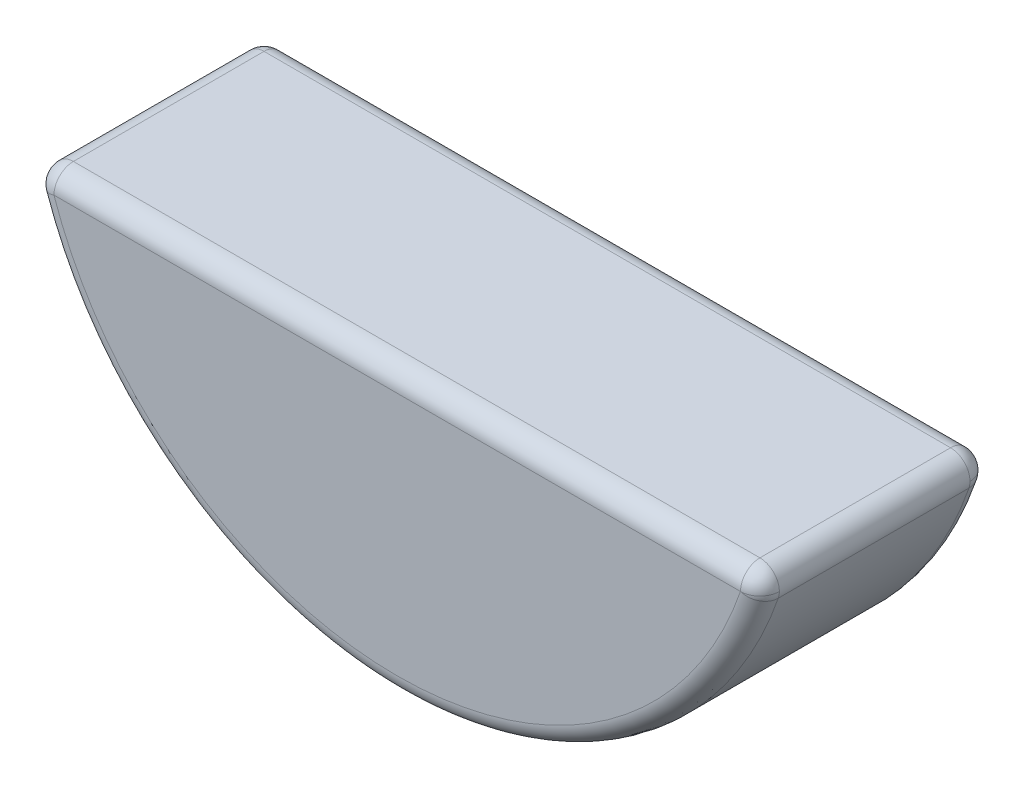
ISO-10303-21;
HEADER;
FILE_DESCRIPTION(('STEP AP214'),'2;1');
FILE_NAME('part.step','',(''),(''),'','','');
FILE_SCHEMA(('AUTOMOTIVE_DESIGN { 1 0 10303 214 1 1 1 1 }'));
ENDSEC;
DATA;
#1=APPLICATION_CONTEXT('core data for automotive mechanical design processes');
#2=APPLICATION_PROTOCOL_DEFINITION('international standard','automotive_design',2000,#1);
#3=PRODUCT_CONTEXT('',#1,'mechanical');
#4=PRODUCT('Part','Part','',(#3));
#5=PRODUCT_RELATED_PRODUCT_CATEGORY('part','',(#4));
#6=PRODUCT_DEFINITION_FORMATION('','',#4);
#7=PRODUCT_DEFINITION_CONTEXT('part definition',#1,'design');
#8=PRODUCT_DEFINITION('design','',#6,#7);
#9=PRODUCT_DEFINITION_SHAPE('','',#8);
#10=(LENGTH_UNIT() NAMED_UNIT(*) SI_UNIT(.MILLI.,.METRE.));
#11=(NAMED_UNIT(*) PLANE_ANGLE_UNIT() SI_UNIT($,.RADIAN.));
#12=(NAMED_UNIT(*) SI_UNIT($,.STERADIAN.) SOLID_ANGLE_UNIT());
#13=UNCERTAINTY_MEASURE_WITH_UNIT(LENGTH_MEASURE(1.E-05),#10,'distance_accuracy_value','');
#14=(GEOMETRIC_REPRESENTATION_CONTEXT(3) GLOBAL_UNCERTAINTY_ASSIGNED_CONTEXT((#13)) GLOBAL_UNIT_ASSIGNED_CONTEXT((#10,
#11,#12)) REPRESENTATION_CONTEXT('',''));
#15=CARTESIAN_POINT('',(0.,0.,0.));
#16=DIRECTION('',(0.,0.,1.));
#17=DIRECTION('',(1.,0.,0.));
#18=AXIS2_PLACEMENT_3D('',#15,#16,#17);
#19=CARTESIAN_POINT('',(4.48689237132197,-1.54671033104868,-1.246));
#20=DIRECTION('',(0.,1.,0.));
#21=DIRECTION('',(1.,0.,0.));
#22=AXIS2_PLACEMENT_3D('',#19,#20,#21);
#23=SPHERICAL_SURFACE('',#22,0.254);
#24=CARTESIAN_POINT('',(4.48689237132197,-1.54671033104868,-1.246));
#25=DIRECTION('',(0.325897667730442,0.945405050847444,0.));
#26=DIRECTION('',(-0.945405050847444,0.325897667730442,0.));
#27=AXIS2_PLACEMENT_3D('',#24,#25,#26);
#28=CIRCLE('',#27,0.254);
#29=CARTESIAN_POINT('',(4.72702525423722,-1.62948833865222,-1.246));
#30=VERTEX_POINT('',#29);
#31=CARTESIAN_POINT('',(4.48689237132197,-1.54671033104867,-1.5));
#32=VERTEX_POINT('',#31);
#33=EDGE_CURVE('E11',#30,#32,#28,.T.);
#34=ORIENTED_EDGE('',*,*,#33,.T.);
#35=CARTESIAN_POINT('',(4.48689237132197,-1.54671033104868,-1.246));
#36=DIRECTION('',(0.,-1.,0.));
#37=DIRECTION('',(0.,0.,-1.));
#38=AXIS2_PLACEMENT_3D('',#35,#36,#37);
#39=CIRCLE('',#38,0.254);
#40=CARTESIAN_POINT('',(4.74089237132197,-1.54671033104868,-1.246));
#41=VERTEX_POINT('',#40);
#42=EDGE_CURVE('E27',#32,#41,#39,.T.);
#43=ORIENTED_EDGE('',*,*,#42,.T.);
#44=CARTESIAN_POINT('',(4.48689237132197,-1.54671033104868,-1.246));
#45=DIRECTION('',(0.,0.,1.));
#46=DIRECTION('',(-1.,0.,0.));
#47=AXIS2_PLACEMENT_3D('',#44,#45,#46);
#48=CIRCLE('',#47,0.254);
#49=EDGE_CURVE('E173',#30,#41,#48,.T.);
#50=ORIENTED_EDGE('',*,*,#49,.F.);
#51=EDGE_LOOP('',(#34,#43,#50));
#52=FACE_BOUND('',#51,.T.);
#53=ADVANCED_FACE('F16',(#52),#23,.T.);
#54=CARTESIAN_POINT('',(4.48689237132197,-1.54671033104868,1.246));
#55=DIRECTION('',(0.,1.,0.));
#56=DIRECTION('',(1.,0.,0.));
#57=AXIS2_PLACEMENT_3D('',#54,#55,#56);
#58=SPHERICAL_SURFACE('',#57,0.254);
#59=CARTESIAN_POINT('',(4.48689237132197,-1.54671033104868,1.246));
#60=DIRECTION('',(0.,0.,-1.));
#61=DIRECTION('',(1.,0.,0.));
#62=AXIS2_PLACEMENT_3D('',#59,#60,#61);
#63=CIRCLE('',#62,0.254);
#64=CARTESIAN_POINT('',(4.74089237132197,-1.54671033104868,1.246));
#65=VERTEX_POINT('',#64);
#66=CARTESIAN_POINT('',(4.72702525423722,-1.62948833865222,1.246));
#67=VERTEX_POINT('',#66);
#68=EDGE_CURVE('E147',#65,#67,#63,.T.);
#69=ORIENTED_EDGE('',*,*,#68,.F.);
#70=CARTESIAN_POINT('',(4.48689237132197,-1.54671033104868,1.246));
#71=DIRECTION('',(0.,-1.,0.));
#72=DIRECTION('',(0.,0.,-1.));
#73=AXIS2_PLACEMENT_3D('',#70,#71,#72);
#74=CIRCLE('',#73,0.254);
#75=CARTESIAN_POINT('',(4.48689237132197,-1.54671033104867,1.5));
#76=VERTEX_POINT('',#75);
#77=EDGE_CURVE('E142',#65,#76,#74,.T.);
#78=ORIENTED_EDGE('',*,*,#77,.T.);
#79=CARTESIAN_POINT('',(4.48689237132197,-1.54671033104867,1.246));
#80=DIRECTION('',(0.325897667730488,0.945405050847428,0.));
#81=DIRECTION('',(-0.945405050847428,0.325897667730488,0.));
#82=AXIS2_PLACEMENT_3D('',#79,#80,#81);
#83=CIRCLE('',#82,0.254);
#84=EDGE_CURVE('E135',#76,#67,#83,.T.);
#85=ORIENTED_EDGE('',*,*,#84,.T.);
#86=EDGE_LOOP('',(#69,#78,#85));
#87=FACE_BOUND('',#86,.T.);
#88=ADVANCED_FACE('F146',(#87),#58,.T.);
#89=CARTESIAN_POINT('',(-4.48689237132197,-1.54671033104868,1.5));
#90=DIRECTION('',(0.,0.,-1.));
#91=DIRECTION('',(-1.,0.,0.));
#92=AXIS2_PLACEMENT_3D('',#89,#90,#91);
#93=CYLINDRICAL_SURFACE('',#92,0.254);
#94=CARTESIAN_POINT('',(-4.48689237132197,-1.54671033104868,1.246));
#95=DIRECTION('',(0.,0.,1.));
#96=DIRECTION('',(1.,0.,0.));
#97=AXIS2_PLACEMENT_3D('',#94,#95,#96);
#98=CIRCLE('',#97,0.254);
#99=CARTESIAN_POINT('',(-4.74089237132197,-1.54671033104868,1.246));
#100=VERTEX_POINT('',#99);
#101=CARTESIAN_POINT('',(-4.72702525423722,-1.62948833865222,1.246));
#102=VERTEX_POINT('',#101);
#103=EDGE_CURVE('E179',#100,#102,#98,.T.);
#104=ORIENTED_EDGE('',*,*,#103,.F.);
#105=DIRECTION('',(0.,0.,-1.));
#106=VECTOR('',#105,1.);
#107=CARTESIAN_POINT('',(-4.74089237132197,-1.54671033104868,1.5));
#108=LINE('',#107,#106);
#109=CARTESIAN_POINT('',(-4.74089237132197,-1.54671033104868,-1.246));
#110=VERTEX_POINT('',#109);
#111=EDGE_CURVE('E143',#100,#110,#108,.T.);
#112=ORIENTED_EDGE('',*,*,#111,.T.);
#113=CARTESIAN_POINT('',(-4.48689237132197,-1.54671033104868,-1.246));
#114=DIRECTION('',(0.,0.,-1.));
#115=DIRECTION('',(-1.,0.,0.));
#116=AXIS2_PLACEMENT_3D('',#113,#114,#115);
#117=CIRCLE('',#116,0.254);
#118=CARTESIAN_POINT('',(-4.72702525423722,-1.62948833865222,-1.246));
#119=VERTEX_POINT('',#118);
#120=EDGE_CURVE('E183',#119,#110,#117,.T.);
#121=ORIENTED_EDGE('',*,*,#120,.F.);
#122=DIRECTION('',(0.,0.,-1.));
#123=VECTOR('',#122,1.);
#124=CARTESIAN_POINT('',(-4.72702525423722,-1.62948833865222,1.5));
#125=LINE('',#124,#123);
#126=EDGE_CURVE('E201',#102,#119,#125,.T.);
#127=ORIENTED_EDGE('',*,*,#126,.F.);
#128=EDGE_LOOP('',(#104,#112,#121,#127));
#129=FACE_BOUND('',#128,.T.);
#130=ADVANCED_FACE('F310',(#129),#93,.T.);
#131=CARTESIAN_POINT('',(0.,0.,1.5));
#132=DIRECTION('',(0.,0.,-1.));
#133=DIRECTION('',(-1.,0.,0.));
#134=AXIS2_PLACEMENT_3D('',#131,#132,#133);
#135=CYLINDRICAL_SURFACE('',#134,5.);
#136=ORIENTED_EDGE('',*,*,#126,.T.);
#137=CARTESIAN_POINT('',(0.,0.,-1.246));
#138=DIRECTION('',(0.,0.,1.));
#139=DIRECTION('',(1.,0.,0.));
#140=AXIS2_PLACEMENT_3D('',#137,#138,#139);
#141=CIRCLE('',#140,5.);
#142=EDGE_CURVE('E205',#119,#30,#141,.T.);
#143=ORIENTED_EDGE('',*,*,#142,.T.);
#144=DIRECTION('',(0.,0.,1.));
#145=VECTOR('',#144,1.);
#146=CARTESIAN_POINT('',(4.72702525423722,-1.62948833865222,1.5));
#147=LINE('',#146,#145);
#148=EDGE_CURVE('E209',#30,#67,#147,.T.);
#149=ORIENTED_EDGE('',*,*,#148,.T.);
#150=CARTESIAN_POINT('',(0.,0.,1.246));
#151=DIRECTION('',(0.,0.,-1.));
#152=DIRECTION('',(1.,0.,0.));
#153=AXIS2_PLACEMENT_3D('',#150,#151,#152);
#154=CIRCLE('',#153,5.);
#155=EDGE_CURVE('E139',#67,#102,#154,.T.);
#156=ORIENTED_EDGE('',*,*,#155,.T.);
#157=EDGE_LOOP('',(#136,#143,#149,#156));
#158=FACE_BOUND('',#157,.T.);
#159=ADVANCED_FACE('F325',(#158),#135,.T.);
#160=CARTESIAN_POINT('',(-4.83,-1.29271033104868,1.5));
#161=DIRECTION('',(0.,-1.,0.));
#162=DIRECTION('',(0.,0.,-1.));
#163=AXIS2_PLACEMENT_3D('',#160,#161,#162);
#164=PLANE('',#163);
#165=DIRECTION('',(1.,0.,0.));
#166=VECTOR('',#165,1.);
#167=CARTESIAN_POINT('',(4.83,-1.29271033104868,1.246));
#168=LINE('',#167,#166);
#169=CARTESIAN_POINT('',(-4.48689237132197,-1.29271033104868,1.246));
#170=VERTEX_POINT('',#169);
#171=CARTESIAN_POINT('',(4.48689237132197,-1.29271033104868,1.246));
#172=VERTEX_POINT('',#171);
#173=EDGE_CURVE('E190',#170,#172,#168,.T.);
#174=ORIENTED_EDGE('',*,*,#173,.T.);
#175=DIRECTION('',(0.,0.,-1.));
#176=VECTOR('',#175,1.);
#177=CARTESIAN_POINT('',(4.48689237132197,-1.29271033104868,1.5));
#178=LINE('',#177,#176);
#179=CARTESIAN_POINT('',(4.48689237132197,-1.29271033104868,-1.246));
#180=VERTEX_POINT('',#179);
#181=EDGE_CURVE('E186',#172,#180,#178,.T.);
#182=ORIENTED_EDGE('',*,*,#181,.T.);
#183=DIRECTION('',(-1.,0.,0.));
#184=VECTOR('',#183,1.);
#185=CARTESIAN_POINT('',(-4.83,-1.29271033104868,-1.246));
#186=LINE('',#185,#184);
#187=CARTESIAN_POINT('',(-4.48689237132197,-1.29271033104868,-1.246));
#188=VERTEX_POINT('',#187);
#189=EDGE_CURVE('E191',#180,#188,#186,.T.);
#190=ORIENTED_EDGE('',*,*,#189,.T.);
#191=DIRECTION('',(0.,0.,1.));
#192=VECTOR('',#191,1.);
#193=CARTESIAN_POINT('',(-4.48689237132197,-1.29271033104868,1.5));
#194=LINE('',#193,#192);
#195=EDGE_CURVE('E131',#188,#170,#194,.T.);
#196=ORIENTED_EDGE('',*,*,#195,.T.);
#197=EDGE_LOOP('',(#174,#182,#190,#196));
#198=FACE_BOUND('',#197,.T.);
#199=ADVANCED_FACE('F221',(#198),#164,.F.);
#200=CARTESIAN_POINT('',(0.,0.,1.5));
#201=DIRECTION('',(0.,0.,1.));
#202=DIRECTION('',(1.,0.,0.));
#203=AXIS2_PLACEMENT_3D('',#200,#201,#202);
#204=PLANE('',#203);
#205=CARTESIAN_POINT('',(0.,0.,1.5));
#206=DIRECTION('',(0.,0.,1.));
#207=DIRECTION('',(1.,0.,0.));
#208=AXIS2_PLACEMENT_3D('',#205,#206,#207);
#209=CIRCLE('',#208,4.746);
#210=CARTESIAN_POINT('',(-4.48689237132197,-1.54671033104867,1.5));
#211=VERTEX_POINT('',#210);
#212=EDGE_CURVE('E123',#211,#76,#209,.T.);
#213=ORIENTED_EDGE('',*,*,#212,.T.);
#214=DIRECTION('',(-1.,0.,0.));
#215=VECTOR('',#214,1.);
#216=CARTESIAN_POINT('',(-4.83,-1.54671033104868,1.5));
#217=LINE('',#216,#215);
#218=EDGE_CURVE('E114',#76,#211,#217,.T.);
#219=ORIENTED_EDGE('',*,*,#218,.T.);
#220=EDGE_LOOP('',(#213,#219));
#221=FACE_BOUND('',#220,.T.);
#222=ADVANCED_FACE('F126',(#221),#204,.T.);
#223=CARTESIAN_POINT('',(0.,0.,-1.5));
#224=DIRECTION('',(0.,0.,1.));
#225=DIRECTION('',(1.,0.,0.));
#226=AXIS2_PLACEMENT_3D('',#223,#224,#225);
#227=PLANE('',#226);
#228=CARTESIAN_POINT('',(0.,0.,-1.5));
#229=DIRECTION('',(0.,0.,-1.));
#230=DIRECTION('',(1.,0.,0.));
#231=AXIS2_PLACEMENT_3D('',#228,#229,#230);
#232=CIRCLE('',#231,4.746);
#233=CARTESIAN_POINT('',(-4.48689237132197,-1.54671033104867,-1.5));
#234=VERTEX_POINT('',#233);
#235=EDGE_CURVE('E20',#32,#234,#232,.T.);
#236=ORIENTED_EDGE('',*,*,#235,.T.);
#237=DIRECTION('',(1.,0.,0.));
#238=VECTOR('',#237,1.);
#239=CARTESIAN_POINT('',(0.,-1.54671033104868,-1.5));
#240=LINE('',#239,#238);
#241=EDGE_CURVE('E41',#234,#32,#240,.T.);
#242=ORIENTED_EDGE('',*,*,#241,.T.);
#243=EDGE_LOOP('',(#236,#242));
#244=FACE_BOUND('',#243,.T.);
#245=ADVANCED_FACE('F397',(#244),#227,.F.);
#246=CARTESIAN_POINT('',(-4.48689237132197,-1.54671033104868,1.5));
#247=DIRECTION('',(0.,0.,-1.));
#248=DIRECTION('',(-1.,0.,0.));
#249=AXIS2_PLACEMENT_3D('',#246,#247,#248);
#250=CYLINDRICAL_SURFACE('',#249,0.254);
#251=ORIENTED_EDGE('',*,*,#111,.F.);
#252=CARTESIAN_POINT('',(-4.48689237132197,-1.54671033104868,1.246));
#253=DIRECTION('',(0.,0.,1.));
#254=DIRECTION('',(1.,0.,0.));
#255=AXIS2_PLACEMENT_3D('',#252,#253,#254);
#256=CIRCLE('',#255,0.254);
#257=EDGE_CURVE('E90',#170,#100,#256,.T.);
#258=ORIENTED_EDGE('',*,*,#257,.F.);
#259=ORIENTED_EDGE('',*,*,#195,.F.);
#260=CARTESIAN_POINT('',(-4.48689237132197,-1.54671033104868,-1.246));
#261=DIRECTION('',(0.,0.,-1.));
#262=DIRECTION('',(-1.,0.,0.));
#263=AXIS2_PLACEMENT_3D('',#260,#261,#262);
#264=CIRCLE('',#263,0.254);
#265=EDGE_CURVE('E195',#110,#188,#264,.T.);
#266=ORIENTED_EDGE('',*,*,#265,.F.);
#267=EDGE_LOOP('',(#251,#258,#259,#266));
#268=FACE_BOUND('',#267,.T.);
#269=ADVANCED_FACE('F359',(#268),#250,.T.);
#270=CARTESIAN_POINT('',(-4.48689237132197,-1.54671033104868,1.246));
#271=DIRECTION('',(0.,1.,0.));
#272=DIRECTION('',(1.,0.,0.));
#273=AXIS2_PLACEMENT_3D('',#270,#271,#272);
#274=SPHERICAL_SURFACE('',#273,0.254);
#275=CARTESIAN_POINT('',(-4.48689237132201,-1.54671033104868,1.246));
#276=DIRECTION('',(1.,-1.43422019667374E-13,0.));
#277=DIRECTION('',(-1.43422019667374E-13,-1.,0.));
#278=AXIS2_PLACEMENT_3D('',#275,#276,#277);
#279=CIRCLE('',#278,0.254);
#280=EDGE_CURVE('E103',#170,#211,#279,.T.);
#281=ORIENTED_EDGE('',*,*,#280,.F.);
#282=ORIENTED_EDGE('',*,*,#257,.T.);
#283=ORIENTED_EDGE('',*,*,#103,.T.);
#284=CARTESIAN_POINT('',(-4.48689237132197,-1.54671033104868,1.246));
#285=DIRECTION('',(0.325897667730442,-0.945405050847444,0.));
#286=DIRECTION('',(-0.945405050847444,-0.325897667730442,0.));
#287=AXIS2_PLACEMENT_3D('',#284,#285,#286);
#288=CIRCLE('',#287,0.254);
#289=EDGE_CURVE('E192',#211,#102,#288,.T.);
#290=ORIENTED_EDGE('',*,*,#289,.F.);
#291=EDGE_LOOP('',(#281,#282,#283,#290));
#292=FACE_BOUND('',#291,.T.);
#293=ADVANCED_FACE('F223',(#292),#274,.T.);
#294=CARTESIAN_POINT('',(-4.48689237132197,-1.54671033104868,-1.246));
#295=DIRECTION('',(0.,1.,0.));
#296=DIRECTION('',(1.,0.,0.));
#297=AXIS2_PLACEMENT_3D('',#294,#295,#296);
#298=SPHERICAL_SURFACE('',#297,0.254);
#299=CARTESIAN_POINT('',(-4.48689237132197,-1.54671033104867,-1.246));
#300=DIRECTION('',(0.325897667730488,-0.945405050847428,0.));
#301=DIRECTION('',(-0.945405050847428,-0.325897667730488,0.));
#302=AXIS2_PLACEMENT_3D('',#299,#300,#301);
#303=CIRCLE('',#302,0.254);
#304=EDGE_CURVE('E156',#119,#234,#303,.T.);
#305=ORIENTED_EDGE('',*,*,#304,.F.);
#306=ORIENTED_EDGE('',*,*,#120,.T.);
#307=ORIENTED_EDGE('',*,*,#265,.T.);
#308=CARTESIAN_POINT('',(-4.48689237132197,-1.54671033104868,-1.246));
#309=DIRECTION('',(1.,0.,-1.43422019667374E-13));
#310=DIRECTION('',(1.43422019667374E-13,0.,1.));
#311=AXIS2_PLACEMENT_3D('',#308,#309,#310);
#312=CIRCLE('',#311,0.254);
#313=EDGE_CURVE('E164',#234,#188,#312,.T.);
#314=ORIENTED_EDGE('',*,*,#313,.F.);
#315=EDGE_LOOP('',(#305,#306,#307,#314));
#316=FACE_BOUND('',#315,.T.);
#317=ADVANCED_FACE('F317',(#316),#298,.T.);
#318=CARTESIAN_POINT('',(0.,0.,1.246));
#319=DIRECTION('',(0.,0.,1.));
#320=DIRECTION('',(1.,0.,0.));
#321=AXIS2_PLACEMENT_3D('',#318,#319,#320);
#322=TOROIDAL_SURFACE('',#321,4.746,0.254);
#323=ORIENTED_EDGE('',*,*,#289,.T.);
#324=ORIENTED_EDGE('',*,*,#155,.F.);
#325=ORIENTED_EDGE('',*,*,#84,.F.);
#326=ORIENTED_EDGE('',*,*,#212,.F.);
#327=EDGE_LOOP('',(#323,#324,#325,#326));
#328=FACE_BOUND('',#327,.T.);
#329=ADVANCED_FACE('F137',(#328),#322,.T.);
#330=CARTESIAN_POINT('',(0.,-1.54671033104868,1.246));
#331=DIRECTION('',(1.,0.,0.));
#332=DIRECTION('',(0.,0.,-1.));
#333=AXIS2_PLACEMENT_3D('',#330,#331,#332);
#334=CYLINDRICAL_SURFACE('',#333,0.254);
#335=ORIENTED_EDGE('',*,*,#280,.T.);
#336=ORIENTED_EDGE('',*,*,#218,.F.);
#337=CARTESIAN_POINT('',(4.48689237132197,-1.54671033104868,1.246));
#338=DIRECTION('',(1.,0.,-1.43422019667374E-13));
#339=DIRECTION('',(-1.43422019667374E-13,0.,-1.));
#340=AXIS2_PLACEMENT_3D('',#337,#338,#339);
#341=CIRCLE('',#340,0.254);
#342=EDGE_CURVE('E118',#172,#76,#341,.T.);
#343=ORIENTED_EDGE('',*,*,#342,.F.);
#344=ORIENTED_EDGE('',*,*,#173,.F.);
#345=EDGE_LOOP('',(#335,#336,#343,#344));
#346=FACE_BOUND('',#345,.T.);
#347=ADVANCED_FACE('F116',(#346),#334,.T.);
#348=CARTESIAN_POINT('',(-4.83,-1.54671033104868,-1.246));
#349=DIRECTION('',(-1.,0.,0.));
#350=DIRECTION('',(0.,0.,1.));
#351=AXIS2_PLACEMENT_3D('',#348,#349,#350);
#352=CYLINDRICAL_SURFACE('',#351,0.254);
#353=ORIENTED_EDGE('',*,*,#313,.T.);
#354=ORIENTED_EDGE('',*,*,#189,.F.);
#355=CARTESIAN_POINT('',(4.48689237132201,-1.54671033104868,-1.246));
#356=DIRECTION('',(1.,1.43422019667374E-13,0.));
#357=DIRECTION('',(-1.43422019667374E-13,1.,0.));
#358=AXIS2_PLACEMENT_3D('',#355,#356,#357);
#359=CIRCLE('',#358,0.254);
#360=EDGE_CURVE('E157',#32,#180,#359,.T.);
#361=ORIENTED_EDGE('',*,*,#360,.F.);
#362=ORIENTED_EDGE('',*,*,#241,.F.);
#363=EDGE_LOOP('',(#353,#354,#361,#362));
#364=FACE_BOUND('',#363,.T.);
#365=ADVANCED_FACE('F339',(#364),#352,.T.);
#366=CARTESIAN_POINT('',(0.,0.,-1.246));
#367=DIRECTION('',(0.,0.,1.));
#368=DIRECTION('',(1.,0.,0.));
#369=AXIS2_PLACEMENT_3D('',#366,#367,#368);
#370=TOROIDAL_SURFACE('',#369,4.746,0.254);
#371=ORIENTED_EDGE('',*,*,#304,.T.);
#372=ORIENTED_EDGE('',*,*,#235,.F.);
#373=ORIENTED_EDGE('',*,*,#33,.F.);
#374=ORIENTED_EDGE('',*,*,#142,.F.);
#375=EDGE_LOOP('',(#371,#372,#373,#374));
#376=FACE_BOUND('',#375,.T.);
#377=ADVANCED_FACE('F343',(#376),#370,.T.);
#378=CARTESIAN_POINT('',(4.48689237132197,-1.54671033104868,1.246));
#379=DIRECTION('',(0.,1.,0.));
#380=DIRECTION('',(1.,0.,0.));
#381=AXIS2_PLACEMENT_3D('',#378,#379,#380);
#382=SPHERICAL_SURFACE('',#381,0.254);
#383=ORIENTED_EDGE('',*,*,#77,.F.);
#384=CARTESIAN_POINT('',(4.48689237132197,-1.54671033104868,1.246));
#385=DIRECTION('',(0.,0.,-1.));
#386=DIRECTION('',(1.,0.,0.));
#387=AXIS2_PLACEMENT_3D('',#384,#385,#386);
#388=CIRCLE('',#387,0.254);
#389=EDGE_CURVE('E154',#172,#65,#388,.T.);
#390=ORIENTED_EDGE('',*,*,#389,.F.);
#391=ORIENTED_EDGE('',*,*,#342,.T.);
#392=EDGE_LOOP('',(#383,#390,#391));
#393=FACE_BOUND('',#392,.T.);
#394=ADVANCED_FACE('F153',(#393),#382,.T.);
#395=CARTESIAN_POINT('',(4.48689237132197,-1.54671033104868,-1.246));
#396=DIRECTION('',(0.,1.,0.));
#397=DIRECTION('',(1.,0.,0.));
#398=AXIS2_PLACEMENT_3D('',#395,#396,#397);
#399=SPHERICAL_SURFACE('',#398,0.254);
#400=ORIENTED_EDGE('',*,*,#42,.F.);
#401=ORIENTED_EDGE('',*,*,#360,.T.);
#402=CARTESIAN_POINT('',(4.48689237132197,-1.54671033104868,-1.246));
#403=DIRECTION('',(0.,0.,1.));
#404=DIRECTION('',(-1.,0.,0.));
#405=AXIS2_PLACEMENT_3D('',#402,#403,#404);
#406=CIRCLE('',#405,0.254);
#407=EDGE_CURVE('E170',#41,#180,#406,.T.);
#408=ORIENTED_EDGE('',*,*,#407,.F.);
#409=EDGE_LOOP('',(#400,#401,#408));
#410=FACE_BOUND('',#409,.T.);
#411=ADVANCED_FACE('F18',(#410),#399,.T.);
#412=CARTESIAN_POINT('',(4.48689237132197,-1.54671033104868,1.5));
#413=DIRECTION('',(0.,0.,-1.));
#414=DIRECTION('',(-1.,0.,0.));
#415=AXIS2_PLACEMENT_3D('',#412,#413,#414);
#416=CYLINDRICAL_SURFACE('',#415,0.254);
#417=ORIENTED_EDGE('',*,*,#389,.T.);
#418=ORIENTED_EDGE('',*,*,#68,.T.);
#419=ORIENTED_EDGE('',*,*,#148,.F.);
#420=ORIENTED_EDGE('',*,*,#49,.T.);
#421=ORIENTED_EDGE('',*,*,#407,.T.);
#422=ORIENTED_EDGE('',*,*,#181,.F.);
#423=EDGE_LOOP('',(#417,#418,#419,#420,#421,#422));
#424=FACE_BOUND('',#423,.T.);
#425=ADVANCED_FACE('F215',(#424),#416,.T.);
#426=CLOSED_SHELL('',(#53,#88,#130,#159,#199,#222,#245,#269,#293,#317,#329,#347,#365,#377,#394,
#411,#425));
#427=MANIFOLD_SOLID_BREP('B1',#426);
#428=ADVANCED_BREP_SHAPE_REPRESENTATION('',(#18,#427),#14);
#429=SHAPE_DEFINITION_REPRESENTATION(#9,#428);
ENDSEC;
END-ISO-10303-21;
